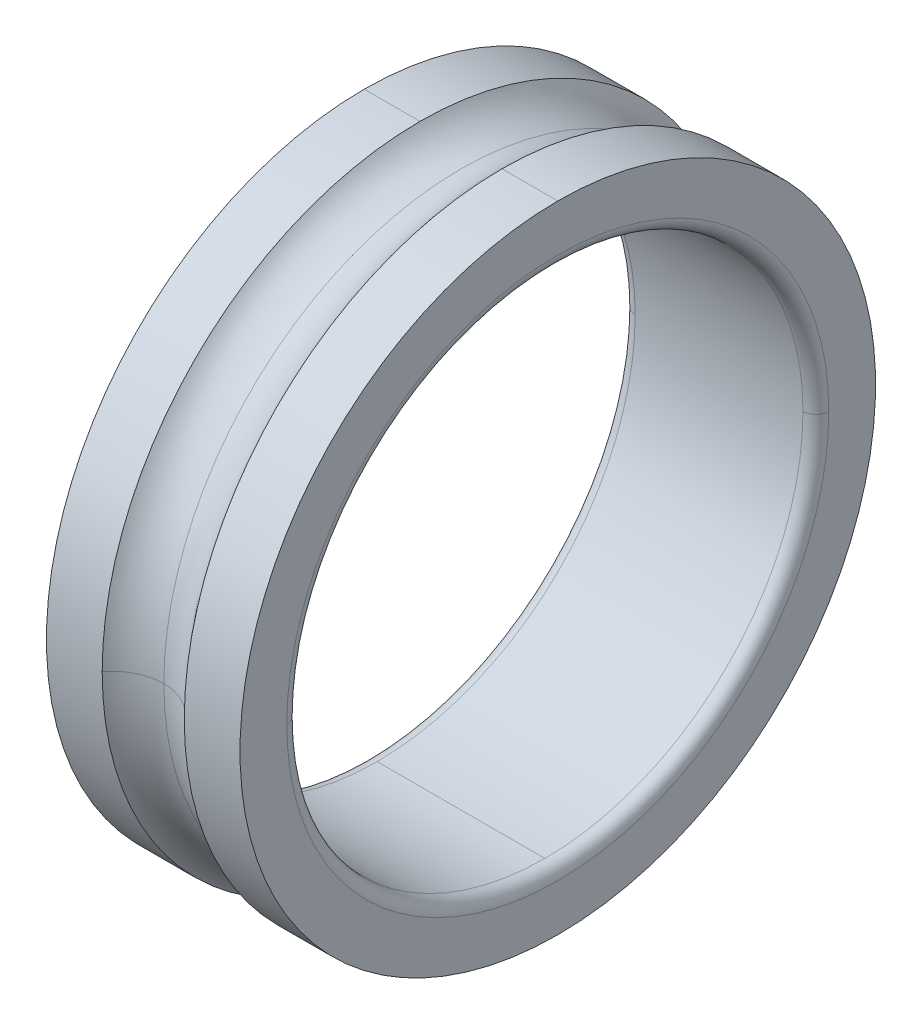
ISO-10303-21;
HEADER;
FILE_DESCRIPTION(('STEP AP214'),'2;1');
FILE_NAME('part.step','',(''),(''),'','','');
FILE_SCHEMA(('AUTOMOTIVE_DESIGN { 1 0 10303 214 1 1 1 1 }'));
ENDSEC;
DATA;
#1=APPLICATION_CONTEXT('core data for automotive mechanical design processes');
#2=APPLICATION_PROTOCOL_DEFINITION('international standard','automotive_design',2000,#1);
#3=PRODUCT_CONTEXT('',#1,'mechanical');
#4=PRODUCT('Part','Part','',(#3));
#5=PRODUCT_RELATED_PRODUCT_CATEGORY('part','',(#4));
#6=PRODUCT_DEFINITION_FORMATION('','',#4);
#7=PRODUCT_DEFINITION_CONTEXT('part definition',#1,'design');
#8=PRODUCT_DEFINITION('design','',#6,#7);
#9=PRODUCT_DEFINITION_SHAPE('','',#8);
#10=(LENGTH_UNIT() NAMED_UNIT(*) SI_UNIT(.MILLI.,.METRE.));
#11=(NAMED_UNIT(*) PLANE_ANGLE_UNIT() SI_UNIT($,.RADIAN.));
#12=(NAMED_UNIT(*) SI_UNIT($,.STERADIAN.) SOLID_ANGLE_UNIT());
#13=UNCERTAINTY_MEASURE_WITH_UNIT(LENGTH_MEASURE(1.E-05),#10,'distance_accuracy_value','');
#14=(GEOMETRIC_REPRESENTATION_CONTEXT(3) GLOBAL_UNCERTAINTY_ASSIGNED_CONTEXT((#13)) GLOBAL_UNIT_ASSIGNED_CONTEXT((#10,
#11,#12)) REPRESENTATION_CONTEXT('',''));
#15=CARTESIAN_POINT('',(0.,0.,0.));
#16=DIRECTION('',(0.,0.,1.));
#17=DIRECTION('',(1.,0.,0.));
#18=AXIS2_PLACEMENT_3D('',#15,#16,#17);
#19=CARTESIAN_POINT('',(12.8399949685455,0.,0.));
#20=DIRECTION('',(1.,0.,0.));
#21=DIRECTION('',(0.,1.,0.));
#22=AXIS2_PLACEMENT_3D('',#19,#20,#21);
#23=CYLINDRICAL_SURFACE('',#22,24.625);
#24=DIRECTION('',(1.,0.,0.));
#25=VECTOR('',#24,1.);
#26=CARTESIAN_POINT('',(12.8399949685455,24.625,0.));
#27=LINE('',#26,#25);
#28=CARTESIAN_POINT('',(10.679989937091,24.625,0.));
#29=VERTEX_POINT('',#28);
#30=CARTESIAN_POINT('',(15.,24.625,0.));
#31=VERTEX_POINT('',#30);
#32=EDGE_CURVE('E183',#29,#31,#27,.T.);
#33=ORIENTED_EDGE('',*,*,#32,.T.);
#34=CARTESIAN_POINT('',(15.,0.,0.));
#35=DIRECTION('',(1.,0.,0.));
#36=DIRECTION('',(0.,1.,0.));
#37=AXIS2_PLACEMENT_3D('',#34,#35,#36);
#38=CIRCLE('',#37,24.625);
#39=CARTESIAN_POINT('',(15.,-24.625,0.));
#40=VERTEX_POINT('',#39);
#41=EDGE_CURVE('E137',#40,#31,#38,.T.);
#42=ORIENTED_EDGE('',*,*,#41,.F.);
#43=DIRECTION('',(-1.,0.,0.));
#44=VECTOR('',#43,1.);
#45=CARTESIAN_POINT('',(12.8399949685455,-24.625,0.));
#46=LINE('',#45,#44);
#47=CARTESIAN_POINT('',(10.679989937091,-24.625,0.));
#48=VERTEX_POINT('',#47);
#49=EDGE_CURVE('E191',#40,#48,#46,.T.);
#50=ORIENTED_EDGE('',*,*,#49,.T.);
#51=CARTESIAN_POINT('',(10.679989937091,0.,0.));
#52=DIRECTION('',(1.,0.,0.));
#53=DIRECTION('',(0.,1.,0.));
#54=AXIS2_PLACEMENT_3D('',#51,#52,#53);
#55=CIRCLE('',#54,24.625);
#56=CARTESIAN_POINT('',(10.679989937091,0.,-24.625));
#57=VERTEX_POINT('',#56);
#58=EDGE_CURVE('E174',#48,#57,#55,.T.);
#59=ORIENTED_EDGE('',*,*,#58,.T.);
#60=CARTESIAN_POINT('',(10.679989937091,0.,0.));
#61=DIRECTION('',(1.,0.,0.));
#62=DIRECTION('',(0.,1.,0.));
#63=AXIS2_PLACEMENT_3D('',#60,#61,#62);
#64=CIRCLE('',#63,24.625);
#65=EDGE_CURVE('E180',#57,#29,#64,.T.);
#66=ORIENTED_EDGE('',*,*,#65,.T.);
#67=EDGE_LOOP('',(#33,#42,#50,#59,#66));
#68=FACE_BOUND('',#67,.T.);
#69=ADVANCED_FACE('F16',(#68),#23,.T.);
#70=CARTESIAN_POINT('',(7.5,0.,0.));
#71=DIRECTION('',(1.,0.,0.));
#72=DIRECTION('',(0.,0.,-1.));
#73=AXIS2_PLACEMENT_3D('',#70,#71,#72);
#74=TOROIDAL_SURFACE('',#73,27.,3.969);
#75=CARTESIAN_POINT('',(7.5,0.,0.));
#76=DIRECTION('',(-1.,0.,0.));
#77=DIRECTION('',(0.,0.,1.));
#78=AXIS2_PLACEMENT_3D('',#75,#76,#77);
#79=CIRCLE('',#78,23.031);
#80=CARTESIAN_POINT('',(7.5,0.,23.031));
#81=VERTEX_POINT('',#80);
#82=CARTESIAN_POINT('',(7.5,0.,-23.031));
#83=VERTEX_POINT('',#82);
#84=EDGE_CURVE('E167',#81,#83,#79,.T.);
#85=ORIENTED_EDGE('',*,*,#84,.T.);
#86=CARTESIAN_POINT('',(7.5,0.,-27.));
#87=DIRECTION('',(0.,-1.,0.));
#88=DIRECTION('',(0.,0.,-1.));
#89=AXIS2_PLACEMENT_3D('',#86,#87,#88);
#90=CIRCLE('',#89,3.969);
#91=CARTESIAN_POINT('',(4.320010062909,0.,-24.625));
#92=VERTEX_POINT('',#91);
#93=EDGE_CURVE('E160',#83,#92,#90,.T.);
#94=ORIENTED_EDGE('',*,*,#93,.T.);
#95=CARTESIAN_POINT('',(4.320010062909,0.,0.));
#96=DIRECTION('',(1.,0.,0.));
#97=DIRECTION('',(0.,1.,0.));
#98=AXIS2_PLACEMENT_3D('',#95,#96,#97);
#99=CIRCLE('',#98,24.625);
#100=CARTESIAN_POINT('',(4.320010062909,24.625,0.));
#101=VERTEX_POINT('',#100);
#102=EDGE_CURVE('E11',#92,#101,#99,.T.);
#103=ORIENTED_EDGE('',*,*,#102,.T.);
#104=CARTESIAN_POINT('',(4.320010062909,0.,0.));
#105=DIRECTION('',(1.,0.,0.));
#106=DIRECTION('',(0.,1.,0.));
#107=AXIS2_PLACEMENT_3D('',#104,#105,#106);
#108=CIRCLE('',#107,24.625);
#109=CARTESIAN_POINT('',(4.320010062909,0.,24.625));
#110=VERTEX_POINT('',#109);
#111=EDGE_CURVE('E159',#101,#110,#108,.T.);
#112=ORIENTED_EDGE('',*,*,#111,.T.);
#113=CARTESIAN_POINT('',(7.5,0.,27.));
#114=DIRECTION('',(0.,-1.,0.));
#115=DIRECTION('',(0.,0.,1.));
#116=AXIS2_PLACEMENT_3D('',#113,#114,#115);
#117=CIRCLE('',#116,3.969);
#118=EDGE_CURVE('E201',#110,#81,#117,.T.);
#119=ORIENTED_EDGE('',*,*,#118,.T.);
#120=EDGE_LOOP('',(#85,#94,#103,#112,#119));
#121=FACE_BOUND('',#120,.T.);
#122=ADVANCED_FACE('F259',(#121),#74,.F.);
#123=CARTESIAN_POINT('',(2.1600050314545,0.,0.));
#124=DIRECTION('',(1.,0.,0.));
#125=DIRECTION('',(0.,1.,0.));
#126=AXIS2_PLACEMENT_3D('',#123,#124,#125);
#127=CYLINDRICAL_SURFACE('',#126,24.625);
#128=DIRECTION('',(1.,0.,0.));
#129=VECTOR('',#128,1.);
#130=CARTESIAN_POINT('',(2.1600050314545,24.625,0.));
#131=LINE('',#130,#129);
#132=CARTESIAN_POINT('',(0.,24.625,0.));
#133=VERTEX_POINT('',#132);
#134=EDGE_CURVE('E148',#133,#101,#131,.T.);
#135=ORIENTED_EDGE('',*,*,#134,.T.);
#136=ORIENTED_EDGE('',*,*,#102,.F.);
#137=CARTESIAN_POINT('',(4.320010062909,0.,0.));
#138=DIRECTION('',(1.,0.,0.));
#139=DIRECTION('',(0.,1.,0.));
#140=AXIS2_PLACEMENT_3D('',#137,#138,#139);
#141=CIRCLE('',#140,24.625);
#142=CARTESIAN_POINT('',(4.320010062909,-24.625,0.));
#143=VERTEX_POINT('',#142);
#144=EDGE_CURVE('E163',#143,#92,#141,.T.);
#145=ORIENTED_EDGE('',*,*,#144,.F.);
#146=DIRECTION('',(-1.,0.,0.));
#147=VECTOR('',#146,1.);
#148=CARTESIAN_POINT('',(2.1600050314545,-24.625,0.));
#149=LINE('',#148,#147);
#150=CARTESIAN_POINT('',(0.,-24.625,0.));
#151=VERTEX_POINT('',#150);
#152=EDGE_CURVE('E150',#143,#151,#149,.T.);
#153=ORIENTED_EDGE('',*,*,#152,.T.);
#154=CARTESIAN_POINT('',(0.,0.,0.));
#155=DIRECTION('',(1.,0.,0.));
#156=DIRECTION('',(0.,1.,0.));
#157=AXIS2_PLACEMENT_3D('',#154,#155,#156);
#158=CIRCLE('',#157,24.625);
#159=EDGE_CURVE('E24',#151,#133,#158,.T.);
#160=ORIENTED_EDGE('',*,*,#159,.T.);
#161=EDGE_LOOP('',(#135,#136,#145,#153,#160));
#162=FACE_BOUND('',#161,.T.);
#163=ADVANCED_FACE('F146',(#162),#127,.T.);
#164=CARTESIAN_POINT('',(0.,22.8125,0.));
#165=DIRECTION('',(-1.,0.,0.));
#166=DIRECTION('',(0.,0.,1.));
#167=AXIS2_PLACEMENT_3D('',#164,#165,#166);
#168=PLANE('',#167);
#169=CARTESIAN_POINT('',(0.,0.,0.));
#170=DIRECTION('',(1.,0.,0.));
#171=DIRECTION('',(0.,1.,0.));
#172=AXIS2_PLACEMENT_3D('',#169,#170,#171);
#173=CIRCLE('',#172,21.);
#174=CARTESIAN_POINT('',(0.,0.,21.));
#175=VERTEX_POINT('',#174);
#176=CARTESIAN_POINT('',(0.,0.,-21.));
#177=VERTEX_POINT('',#176);
#178=EDGE_CURVE('E140',#175,#177,#173,.T.);
#179=ORIENTED_EDGE('',*,*,#178,.T.);
#180=CARTESIAN_POINT('',(0.,0.,0.));
#181=DIRECTION('',(1.,0.,0.));
#182=DIRECTION('',(0.,1.,0.));
#183=AXIS2_PLACEMENT_3D('',#180,#181,#182);
#184=CIRCLE('',#183,21.);
#185=EDGE_CURVE('E222',#177,#175,#184,.T.);
#186=ORIENTED_EDGE('',*,*,#185,.T.);
#187=EDGE_LOOP('',(#179,#186));
#188=FACE_BOUND('',#187,.T.);
#189=CARTESIAN_POINT('',(0.,0.,0.));
#190=DIRECTION('',(1.,0.,0.));
#191=DIRECTION('',(0.,1.,0.));
#192=AXIS2_PLACEMENT_3D('',#189,#190,#191);
#193=CIRCLE('',#192,24.625);
#194=EDGE_CURVE('E153',#133,#151,#193,.T.);
#195=ORIENTED_EDGE('',*,*,#194,.F.);
#196=ORIENTED_EDGE('',*,*,#159,.F.);
#197=EDGE_LOOP('',(#195,#196));
#198=FACE_BOUND('',#197,.T.);
#199=ADVANCED_FACE('F18',(#188,#198),#168,.T.);
#200=CARTESIAN_POINT('',(1.,0.,0.));
#201=DIRECTION('',(1.,0.,0.));
#202=DIRECTION('',(0.,0.,-1.));
#203=AXIS2_PLACEMENT_3D('',#200,#201,#202);
#204=TOROIDAL_SURFACE('',#203,21.,1.);
#205=CARTESIAN_POINT('',(1.,0.,-21.));
#206=DIRECTION('',(0.,-1.,0.));
#207=DIRECTION('',(0.,0.,-1.));
#208=AXIS2_PLACEMENT_3D('',#205,#206,#207);
#209=CIRCLE('',#208,1.);
#210=CARTESIAN_POINT('',(1.,0.,-20.));
#211=VERTEX_POINT('',#210);
#212=EDGE_CURVE('E210',#211,#177,#209,.T.);
#213=ORIENTED_EDGE('',*,*,#212,.T.);
#214=ORIENTED_EDGE('',*,*,#178,.F.);
#215=CARTESIAN_POINT('',(1.,0.,21.));
#216=DIRECTION('',(0.,-1.,0.));
#217=DIRECTION('',(0.,0.,1.));
#218=AXIS2_PLACEMENT_3D('',#215,#216,#217);
#219=CIRCLE('',#218,1.);
#220=CARTESIAN_POINT('',(1.,0.,20.));
#221=VERTEX_POINT('',#220);
#222=EDGE_CURVE('E219',#175,#221,#219,.T.);
#223=ORIENTED_EDGE('',*,*,#222,.T.);
#224=CARTESIAN_POINT('',(1.,0.,0.));
#225=DIRECTION('',(1.,0.,0.));
#226=DIRECTION('',(0.,1.,0.));
#227=AXIS2_PLACEMENT_3D('',#224,#225,#226);
#228=CIRCLE('',#227,20.);
#229=CARTESIAN_POINT('',(1.,-20.,0.));
#230=VERTEX_POINT('',#229);
#231=EDGE_CURVE('E138',#221,#230,#228,.T.);
#232=ORIENTED_EDGE('',*,*,#231,.T.);
#233=CARTESIAN_POINT('',(1.,0.,0.));
#234=DIRECTION('',(1.,0.,0.));
#235=DIRECTION('',(0.,1.,0.));
#236=AXIS2_PLACEMENT_3D('',#233,#234,#235);
#237=CIRCLE('',#236,20.);
#238=EDGE_CURVE('E130',#230,#211,#237,.T.);
#239=ORIENTED_EDGE('',*,*,#238,.T.);
#240=EDGE_LOOP('',(#213,#214,#223,#232,#239));
#241=FACE_BOUND('',#240,.T.);
#242=ADVANCED_FACE('F228',(#241),#204,.T.);
#243=CARTESIAN_POINT('',(7.5,0.,0.));
#244=DIRECTION('',(1.,0.,0.));
#245=DIRECTION('',(0.,1.,0.));
#246=AXIS2_PLACEMENT_3D('',#243,#244,#245);
#247=CYLINDRICAL_SURFACE('',#246,20.);
#248=DIRECTION('',(1.,0.,0.));
#249=VECTOR('',#248,1.);
#250=CARTESIAN_POINT('',(7.5,20.,0.));
#251=LINE('',#250,#249);
#252=CARTESIAN_POINT('',(1.,20.,0.));
#253=VERTEX_POINT('',#252);
#254=CARTESIAN_POINT('',(14.,20.,0.));
#255=VERTEX_POINT('',#254);
#256=EDGE_CURVE('E225',#253,#255,#251,.T.);
#257=ORIENTED_EDGE('',*,*,#256,.T.);
#258=CARTESIAN_POINT('',(14.,0.,0.));
#259=DIRECTION('',(1.,0.,0.));
#260=DIRECTION('',(0.,1.,0.));
#261=AXIS2_PLACEMENT_3D('',#258,#259,#260);
#262=CIRCLE('',#261,20.);
#263=CARTESIAN_POINT('',(14.,0.,20.));
#264=VERTEX_POINT('',#263);
#265=EDGE_CURVE('E121',#255,#264,#262,.T.);
#266=ORIENTED_EDGE('',*,*,#265,.T.);
#267=CARTESIAN_POINT('',(14.,0.,0.));
#268=DIRECTION('',(1.,0.,0.));
#269=DIRECTION('',(0.,1.,0.));
#270=AXIS2_PLACEMENT_3D('',#267,#268,#269);
#271=CIRCLE('',#270,20.);
#272=CARTESIAN_POINT('',(14.,-20.,0.));
#273=VERTEX_POINT('',#272);
#274=EDGE_CURVE('E31',#264,#273,#271,.T.);
#275=ORIENTED_EDGE('',*,*,#274,.T.);
#276=DIRECTION('',(-1.,0.,0.));
#277=VECTOR('',#276,1.);
#278=CARTESIAN_POINT('',(7.5,-20.,0.));
#279=LINE('',#278,#277);
#280=EDGE_CURVE('E128',#273,#230,#279,.T.);
#281=ORIENTED_EDGE('',*,*,#280,.T.);
#282=ORIENTED_EDGE('',*,*,#231,.F.);
#283=CARTESIAN_POINT('',(1.,0.,0.));
#284=DIRECTION('',(1.,0.,0.));
#285=DIRECTION('',(0.,1.,0.));
#286=AXIS2_PLACEMENT_3D('',#283,#284,#285);
#287=CIRCLE('',#286,20.);
#288=EDGE_CURVE('E216',#253,#221,#287,.T.);
#289=ORIENTED_EDGE('',*,*,#288,.F.);
#290=EDGE_LOOP('',(#257,#266,#275,#281,#282,#289));
#291=FACE_BOUND('',#290,.T.);
#292=ADVANCED_FACE('F237',(#291),#247,.F.);
#293=CARTESIAN_POINT('',(14.,0.,0.));
#294=DIRECTION('',(1.,0.,0.));
#295=DIRECTION('',(0.,0.,-1.));
#296=AXIS2_PLACEMENT_3D('',#293,#294,#295);
#297=TOROIDAL_SURFACE('',#296,21.,1.);
#298=CARTESIAN_POINT('',(14.,0.,-21.));
#299=DIRECTION('',(0.,-1.,0.));
#300=DIRECTION('',(0.,0.,-1.));
#301=AXIS2_PLACEMENT_3D('',#298,#299,#300);
#302=CIRCLE('',#301,1.);
#303=CARTESIAN_POINT('',(15.,0.,-21.));
#304=VERTEX_POINT('',#303);
#305=CARTESIAN_POINT('',(14.,0.,-20.));
#306=VERTEX_POINT('',#305);
#307=EDGE_CURVE('E107',#304,#306,#302,.T.);
#308=ORIENTED_EDGE('',*,*,#307,.T.);
#309=CARTESIAN_POINT('',(14.,0.,0.));
#310=DIRECTION('',(1.,0.,0.));
#311=DIRECTION('',(0.,1.,0.));
#312=AXIS2_PLACEMENT_3D('',#309,#310,#311);
#313=CIRCLE('',#312,20.);
#314=EDGE_CURVE('E111',#273,#306,#313,.T.);
#315=ORIENTED_EDGE('',*,*,#314,.F.);
#316=ORIENTED_EDGE('',*,*,#274,.F.);
#317=CARTESIAN_POINT('',(14.,0.,21.));
#318=DIRECTION('',(0.,-1.,0.));
#319=DIRECTION('',(0.,0.,1.));
#320=AXIS2_PLACEMENT_3D('',#317,#318,#319);
#321=CIRCLE('',#320,1.);
#322=CARTESIAN_POINT('',(15.,0.,21.));
#323=VERTEX_POINT('',#322);
#324=EDGE_CURVE('E134',#264,#323,#321,.T.);
#325=ORIENTED_EDGE('',*,*,#324,.T.);
#326=CARTESIAN_POINT('',(15.,0.,0.));
#327=DIRECTION('',(1.,0.,0.));
#328=DIRECTION('',(0.,1.,0.));
#329=AXIS2_PLACEMENT_3D('',#326,#327,#328);
#330=CIRCLE('',#329,21.);
#331=EDGE_CURVE('E39',#323,#304,#330,.T.);
#332=ORIENTED_EDGE('',*,*,#331,.T.);
#333=EDGE_LOOP('',(#308,#315,#316,#325,#332));
#334=FACE_BOUND('',#333,.T.);
#335=ADVANCED_FACE('F109',(#334),#297,.T.);
#336=CARTESIAN_POINT('',(15.,22.8125,0.));
#337=DIRECTION('',(1.,0.,0.));
#338=DIRECTION('',(0.,1.,0.));
#339=AXIS2_PLACEMENT_3D('',#336,#337,#338);
#340=PLANE('',#339);
#341=CARTESIAN_POINT('',(15.,0.,0.));
#342=DIRECTION('',(1.,0.,0.));
#343=DIRECTION('',(0.,1.,0.));
#344=AXIS2_PLACEMENT_3D('',#341,#342,#343);
#345=CIRCLE('',#344,21.);
#346=EDGE_CURVE('E115',#304,#323,#345,.T.);
#347=ORIENTED_EDGE('',*,*,#346,.F.);
#348=ORIENTED_EDGE('',*,*,#331,.F.);
#349=EDGE_LOOP('',(#347,#348));
#350=FACE_BOUND('',#349,.T.);
#351=CARTESIAN_POINT('',(15.,0.,0.));
#352=DIRECTION('',(1.,0.,0.));
#353=DIRECTION('',(0.,1.,0.));
#354=AXIS2_PLACEMENT_3D('',#351,#352,#353);
#355=CIRCLE('',#354,24.625);
#356=EDGE_CURVE('E193',#31,#40,#355,.T.);
#357=ORIENTED_EDGE('',*,*,#356,.T.);
#358=ORIENTED_EDGE('',*,*,#41,.T.);
#359=EDGE_LOOP('',(#357,#358));
#360=FACE_BOUND('',#359,.T.);
#361=ADVANCED_FACE('F238',(#350,#360),#340,.T.);
#362=CARTESIAN_POINT('',(14.,0.,0.));
#363=DIRECTION('',(1.,0.,0.));
#364=DIRECTION('',(0.,0.,-1.));
#365=AXIS2_PLACEMENT_3D('',#362,#363,#364);
#366=TOROIDAL_SURFACE('',#365,21.,1.);
#367=ORIENTED_EDGE('',*,*,#307,.F.);
#368=ORIENTED_EDGE('',*,*,#346,.T.);
#369=ORIENTED_EDGE('',*,*,#324,.F.);
#370=ORIENTED_EDGE('',*,*,#265,.F.);
#371=CARTESIAN_POINT('',(14.,0.,0.));
#372=DIRECTION('',(1.,0.,0.));
#373=DIRECTION('',(0.,1.,0.));
#374=AXIS2_PLACEMENT_3D('',#371,#372,#373);
#375=CIRCLE('',#374,20.);
#376=EDGE_CURVE('E116',#306,#255,#375,.T.);
#377=ORIENTED_EDGE('',*,*,#376,.F.);
#378=EDGE_LOOP('',(#367,#368,#369,#370,#377));
#379=FACE_BOUND('',#378,.T.);
#380=ADVANCED_FACE('F119',(#379),#366,.T.);
#381=CARTESIAN_POINT('',(7.5,0.,0.));
#382=DIRECTION('',(1.,0.,0.));
#383=DIRECTION('',(0.,1.,0.));
#384=AXIS2_PLACEMENT_3D('',#381,#382,#383);
#385=CYLINDRICAL_SURFACE('',#384,20.);
#386=ORIENTED_EDGE('',*,*,#256,.F.);
#387=CARTESIAN_POINT('',(1.,0.,0.));
#388=DIRECTION('',(1.,0.,0.));
#389=DIRECTION('',(0.,1.,0.));
#390=AXIS2_PLACEMENT_3D('',#387,#388,#389);
#391=CIRCLE('',#390,20.);
#392=EDGE_CURVE('E213',#211,#253,#391,.T.);
#393=ORIENTED_EDGE('',*,*,#392,.F.);
#394=ORIENTED_EDGE('',*,*,#238,.F.);
#395=ORIENTED_EDGE('',*,*,#280,.F.);
#396=ORIENTED_EDGE('',*,*,#314,.T.);
#397=ORIENTED_EDGE('',*,*,#376,.T.);
#398=EDGE_LOOP('',(#386,#393,#394,#395,#396,#397));
#399=FACE_BOUND('',#398,.T.);
#400=ADVANCED_FACE('F125',(#399),#385,.F.);
#401=CARTESIAN_POINT('',(1.,0.,0.));
#402=DIRECTION('',(1.,0.,0.));
#403=DIRECTION('',(0.,0.,-1.));
#404=AXIS2_PLACEMENT_3D('',#401,#402,#403);
#405=TOROIDAL_SURFACE('',#404,21.,1.);
#406=ORIENTED_EDGE('',*,*,#212,.F.);
#407=ORIENTED_EDGE('',*,*,#392,.T.);
#408=ORIENTED_EDGE('',*,*,#288,.T.);
#409=ORIENTED_EDGE('',*,*,#222,.F.);
#410=ORIENTED_EDGE('',*,*,#185,.F.);
#411=EDGE_LOOP('',(#406,#407,#408,#409,#410));
#412=FACE_BOUND('',#411,.T.);
#413=ADVANCED_FACE('F233',(#412),#405,.T.);
#414=CARTESIAN_POINT('',(2.1600050314545,0.,0.));
#415=DIRECTION('',(1.,0.,0.));
#416=DIRECTION('',(0.,1.,0.));
#417=AXIS2_PLACEMENT_3D('',#414,#415,#416);
#418=CYLINDRICAL_SURFACE('',#417,24.625);
#419=ORIENTED_EDGE('',*,*,#134,.F.);
#420=ORIENTED_EDGE('',*,*,#194,.T.);
#421=ORIENTED_EDGE('',*,*,#152,.F.);
#422=CARTESIAN_POINT('',(4.320010062909,0.,0.));
#423=DIRECTION('',(1.,0.,0.));
#424=DIRECTION('',(0.,1.,0.));
#425=AXIS2_PLACEMENT_3D('',#422,#423,#424);
#426=CIRCLE('',#425,24.625);
#427=EDGE_CURVE('E203',#110,#143,#426,.T.);
#428=ORIENTED_EDGE('',*,*,#427,.F.);
#429=ORIENTED_EDGE('',*,*,#111,.F.);
#430=EDGE_LOOP('',(#419,#420,#421,#428,#429));
#431=FACE_BOUND('',#430,.T.);
#432=ADVANCED_FACE('F157',(#431),#418,.T.);
#433=CARTESIAN_POINT('',(7.5,0.,0.));
#434=DIRECTION('',(1.,0.,0.));
#435=DIRECTION('',(0.,0.,-1.));
#436=AXIS2_PLACEMENT_3D('',#433,#434,#435);
#437=TOROIDAL_SURFACE('',#436,27.,3.969);
#438=CARTESIAN_POINT('',(7.5,0.,0.));
#439=DIRECTION('',(-1.,0.,0.));
#440=DIRECTION('',(0.,0.,1.));
#441=AXIS2_PLACEMENT_3D('',#438,#439,#440);
#442=CIRCLE('',#441,23.031);
#443=EDGE_CURVE('E177',#83,#81,#442,.T.);
#444=ORIENTED_EDGE('',*,*,#443,.T.);
#445=ORIENTED_EDGE('',*,*,#118,.F.);
#446=ORIENTED_EDGE('',*,*,#427,.T.);
#447=ORIENTED_EDGE('',*,*,#144,.T.);
#448=ORIENTED_EDGE('',*,*,#93,.F.);
#449=EDGE_LOOP('',(#444,#445,#446,#447,#448));
#450=FACE_BOUND('',#449,.T.);
#451=ADVANCED_FACE('F262',(#450),#437,.F.);
#452=CARTESIAN_POINT('',(12.8399949685455,0.,0.));
#453=DIRECTION('',(1.,0.,0.));
#454=DIRECTION('',(0.,1.,0.));
#455=AXIS2_PLACEMENT_3D('',#452,#453,#454);
#456=CYLINDRICAL_SURFACE('',#455,24.625);
#457=ORIENTED_EDGE('',*,*,#32,.F.);
#458=CARTESIAN_POINT('',(10.679989937091,0.,0.));
#459=DIRECTION('',(1.,0.,0.));
#460=DIRECTION('',(0.,1.,0.));
#461=AXIS2_PLACEMENT_3D('',#458,#459,#460);
#462=CIRCLE('',#461,24.625);
#463=CARTESIAN_POINT('',(10.679989937091,0.,24.625));
#464=VERTEX_POINT('',#463);
#465=EDGE_CURVE('E173',#29,#464,#462,.T.);
#466=ORIENTED_EDGE('',*,*,#465,.T.);
#467=CARTESIAN_POINT('',(10.679989937091,0.,0.));
#468=DIRECTION('',(1.,0.,0.));
#469=DIRECTION('',(0.,1.,0.));
#470=AXIS2_PLACEMENT_3D('',#467,#468,#469);
#471=CIRCLE('',#470,24.625);
#472=EDGE_CURVE('E176',#464,#48,#471,.T.);
#473=ORIENTED_EDGE('',*,*,#472,.T.);
#474=ORIENTED_EDGE('',*,*,#49,.F.);
#475=ORIENTED_EDGE('',*,*,#356,.F.);
#476=EDGE_LOOP('',(#457,#466,#473,#474,#475));
#477=FACE_BOUND('',#476,.T.);
#478=ADVANCED_FACE('F245',(#477),#456,.T.);
#479=CARTESIAN_POINT('',(7.5,0.,0.));
#480=DIRECTION('',(1.,0.,0.));
#481=DIRECTION('',(0.,0.,-1.));
#482=AXIS2_PLACEMENT_3D('',#479,#480,#481);
#483=TOROIDAL_SURFACE('',#482,27.,3.969);
#484=ORIENTED_EDGE('',*,*,#443,.F.);
#485=CARTESIAN_POINT('',(7.5,0.,-27.));
#486=DIRECTION('',(0.,-1.,0.));
#487=DIRECTION('',(0.,0.,-1.));
#488=AXIS2_PLACEMENT_3D('',#485,#486,#487);
#489=CIRCLE('',#488,3.969);
#490=EDGE_CURVE('E187',#57,#83,#489,.T.);
#491=ORIENTED_EDGE('',*,*,#490,.F.);
#492=ORIENTED_EDGE('',*,*,#58,.F.);
#493=ORIENTED_EDGE('',*,*,#472,.F.);
#494=CARTESIAN_POINT('',(7.5,0.,27.));
#495=DIRECTION('',(0.,-1.,0.));
#496=DIRECTION('',(0.,0.,1.));
#497=AXIS2_PLACEMENT_3D('',#494,#495,#496);
#498=CIRCLE('',#497,3.969);
#499=EDGE_CURVE('E170',#81,#464,#498,.T.);
#500=ORIENTED_EDGE('',*,*,#499,.F.);
#501=EDGE_LOOP('',(#484,#491,#492,#493,#500));
#502=FACE_BOUND('',#501,.T.);
#503=ADVANCED_FACE('F257',(#502),#483,.F.);
#504=CARTESIAN_POINT('',(7.5,0.,0.));
#505=DIRECTION('',(1.,0.,0.));
#506=DIRECTION('',(0.,0.,-1.));
#507=AXIS2_PLACEMENT_3D('',#504,#505,#506);
#508=TOROIDAL_SURFACE('',#507,27.,3.969);
#509=ORIENTED_EDGE('',*,*,#84,.F.);
#510=ORIENTED_EDGE('',*,*,#499,.T.);
#511=ORIENTED_EDGE('',*,*,#465,.F.);
#512=ORIENTED_EDGE('',*,*,#65,.F.);
#513=ORIENTED_EDGE('',*,*,#490,.T.);
#514=EDGE_LOOP('',(#509,#510,#511,#512,#513));
#515=FACE_BOUND('',#514,.T.);
#516=ADVANCED_FACE('F254',(#515),#508,.F.);
#517=CLOSED_SHELL('',(#69,#122,#163,#199,#242,#292,#335,#361,#380,#400,#413,#432,#451,#478,#503,#516));
#518=MANIFOLD_SOLID_BREP('B1',#517);
#519=ADVANCED_BREP_SHAPE_REPRESENTATION('',(#18,#518),#14);
#520=SHAPE_DEFINITION_REPRESENTATION(#9,#519);
ENDSEC;
END-ISO-10303-21;
